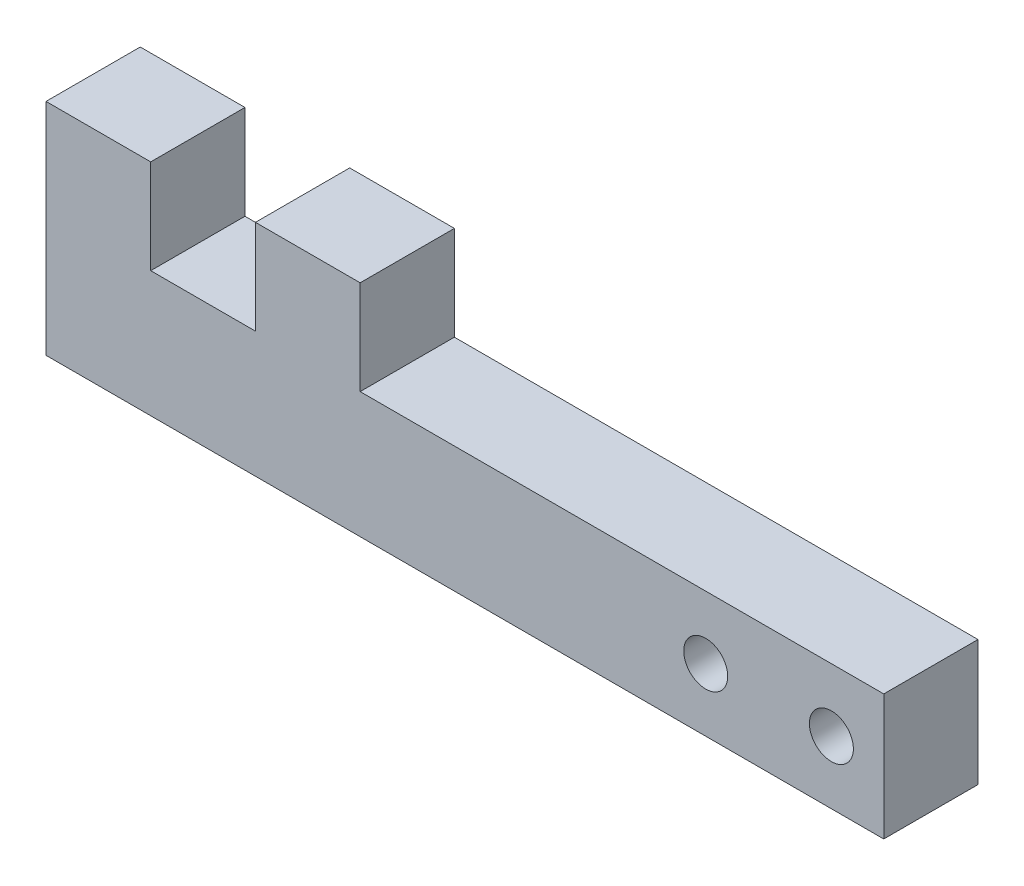
ISO-10303-21;
HEADER;
FILE_DESCRIPTION(('STEP AP214'),'2;1');
FILE_NAME('part.step','',(''),(''),'','','');
FILE_SCHEMA(('AUTOMOTIVE_DESIGN { 1 0 10303 214 1 1 1 1 }'));
ENDSEC;
DATA;
#1=APPLICATION_CONTEXT('core data for automotive mechanical design processes');
#2=APPLICATION_PROTOCOL_DEFINITION('international standard','automotive_design',2000,#1);
#3=PRODUCT_CONTEXT('',#1,'mechanical');
#4=PRODUCT('Part','Part','',(#3));
#5=PRODUCT_RELATED_PRODUCT_CATEGORY('part','',(#4));
#6=PRODUCT_DEFINITION_FORMATION('','',#4);
#7=PRODUCT_DEFINITION_CONTEXT('part definition',#1,'design');
#8=PRODUCT_DEFINITION('design','',#6,#7);
#9=PRODUCT_DEFINITION_SHAPE('','',#8);
#10=(LENGTH_UNIT() NAMED_UNIT(*) SI_UNIT(.MILLI.,.METRE.));
#11=(NAMED_UNIT(*) PLANE_ANGLE_UNIT() SI_UNIT($,.RADIAN.));
#12=(NAMED_UNIT(*) SI_UNIT($,.STERADIAN.) SOLID_ANGLE_UNIT());
#13=UNCERTAINTY_MEASURE_WITH_UNIT(LENGTH_MEASURE(1.E-05),#10,'distance_accuracy_value','');
#14=(GEOMETRIC_REPRESENTATION_CONTEXT(3) GLOBAL_UNCERTAINTY_ASSIGNED_CONTEXT((#13)) GLOBAL_UNIT_ASSIGNED_CONTEXT((#10,
#11,#12)) REPRESENTATION_CONTEXT('',''));
#15=CARTESIAN_POINT('',(0.,0.,0.));
#16=DIRECTION('',(0.,0.,1.));
#17=DIRECTION('',(1.,0.,0.));
#18=AXIS2_PLACEMENT_3D('',#15,#16,#17);
#19=CARTESIAN_POINT('',(0.,12.,9.));
#20=DIRECTION('',(0.,-1.,0.));
#21=DIRECTION('',(1.,0.,0.));
#22=AXIS2_PLACEMENT_3D('',#19,#20,#21);
#23=PLANE('',#22);
#24=DIRECTION('',(-1.,0.,0.));
#25=VECTOR('',#24,1.);
#26=CARTESIAN_POINT('',(0.,12.,9.));
#27=LINE('',#26,#25);
#28=CARTESIAN_POINT('',(20.,12.,9.));
#29=VERTEX_POINT('',#28);
#30=CARTESIAN_POINT('',(10.,12.,9.));
#31=VERTEX_POINT('',#30);
#32=EDGE_CURVE('E48',#29,#31,#27,.T.);
#33=ORIENTED_EDGE('',*,*,#32,.F.);
#34=DIRECTION('',(0.,0.,1.));
#35=VECTOR('',#34,1.);
#36=CARTESIAN_POINT('',(20.,12.,0.));
#37=LINE('',#36,#35);
#38=CARTESIAN_POINT('',(20.,12.,0.));
#39=VERTEX_POINT('',#38);
#40=EDGE_CURVE('E125',#39,#29,#37,.T.);
#41=ORIENTED_EDGE('',*,*,#40,.F.);
#42=DIRECTION('',(-1.,0.,0.));
#43=VECTOR('',#42,1.);
#44=CARTESIAN_POINT('',(0.,12.,0.));
#45=LINE('',#44,#43);
#46=CARTESIAN_POINT('',(10.,12.,0.));
#47=VERTEX_POINT('',#46);
#48=EDGE_CURVE('E112',#39,#47,#45,.T.);
#49=ORIENTED_EDGE('',*,*,#48,.T.);
#50=DIRECTION('',(0.,0.,1.));
#51=VECTOR('',#50,1.);
#52=CARTESIAN_POINT('',(10.,12.,0.));
#53=LINE('',#52,#51);
#54=EDGE_CURVE('E161',#47,#31,#53,.T.);
#55=ORIENTED_EDGE('',*,*,#54,.T.);
#56=EDGE_LOOP('',(#33,#41,#49,#55));
#57=FACE_BOUND('',#56,.T.);
#58=ADVANCED_FACE('F33',(#57),#23,.F.);
#59=CARTESIAN_POINT('',(0.,0.,9.));
#60=DIRECTION('',(1.,0.,0.));
#61=DIRECTION('',(0.,0.,-1.));
#62=AXIS2_PLACEMENT_3D('',#59,#60,#61);
#63=PLANE('',#62);
#64=DIRECTION('',(0.,-1.,0.));
#65=VECTOR('',#64,1.);
#66=CARTESIAN_POINT('',(0.,0.,0.));
#67=LINE('',#66,#65);
#68=CARTESIAN_POINT('',(0.,21.,0.));
#69=VERTEX_POINT('',#68);
#70=CARTESIAN_POINT('',(0.,0.,0.));
#71=VERTEX_POINT('',#70);
#72=EDGE_CURVE('E169',#69,#71,#67,.T.);
#73=ORIENTED_EDGE('',*,*,#72,.T.);
#74=DIRECTION('',(0.,0.,-1.));
#75=VECTOR('',#74,1.);
#76=CARTESIAN_POINT('',(0.,0.,9.));
#77=LINE('',#76,#75);
#78=CARTESIAN_POINT('',(0.,0.,9.));
#79=VERTEX_POINT('',#78);
#80=EDGE_CURVE('E11',#79,#71,#77,.T.);
#81=ORIENTED_EDGE('',*,*,#80,.F.);
#82=DIRECTION('',(0.,-1.,0.));
#83=VECTOR('',#82,1.);
#84=CARTESIAN_POINT('',(0.,0.,9.));
#85=LINE('',#84,#83);
#86=CARTESIAN_POINT('',(0.,21.,9.));
#87=VERTEX_POINT('',#86);
#88=EDGE_CURVE('E173',#87,#79,#85,.T.);
#89=ORIENTED_EDGE('',*,*,#88,.F.);
#90=DIRECTION('',(0.,0.,1.));
#91=VECTOR('',#90,1.);
#92=CARTESIAN_POINT('',(0.,21.,0.));
#93=LINE('',#92,#91);
#94=EDGE_CURVE('E166',#69,#87,#93,.T.);
#95=ORIENTED_EDGE('',*,*,#94,.F.);
#96=EDGE_LOOP('',(#73,#81,#89,#95));
#97=FACE_BOUND('',#96,.T.);
#98=ADVANCED_FACE('F35',(#97),#63,.F.);
#99=CARTESIAN_POINT('',(0.,0.,9.));
#100=DIRECTION('',(0.,1.,0.));
#101=DIRECTION('',(-1.,0.,0.));
#102=AXIS2_PLACEMENT_3D('',#99,#100,#101);
#103=PLANE('',#102);
#104=DIRECTION('',(1.,0.,0.));
#105=VECTOR('',#104,1.);
#106=CARTESIAN_POINT('',(0.,0.,0.));
#107=LINE('',#106,#105);
#108=CARTESIAN_POINT('',(80.,0.,0.));
#109=VERTEX_POINT('',#108);
#110=EDGE_CURVE('E185',#71,#109,#107,.T.);
#111=ORIENTED_EDGE('',*,*,#110,.T.);
#112=DIRECTION('',(0.,0.,-1.));
#113=VECTOR('',#112,1.);
#114=CARTESIAN_POINT('',(80.,0.,9.));
#115=LINE('',#114,#113);
#116=CARTESIAN_POINT('',(80.,0.,9.));
#117=VERTEX_POINT('',#116);
#118=EDGE_CURVE('E41',#117,#109,#115,.T.);
#119=ORIENTED_EDGE('',*,*,#118,.F.);
#120=DIRECTION('',(1.,0.,0.));
#121=VECTOR('',#120,1.);
#122=CARTESIAN_POINT('',(0.,0.,9.));
#123=LINE('',#122,#121);
#124=EDGE_CURVE('E176',#79,#117,#123,.T.);
#125=ORIENTED_EDGE('',*,*,#124,.F.);
#126=ORIENTED_EDGE('',*,*,#80,.T.);
#127=EDGE_LOOP('',(#111,#119,#125,#126));
#128=FACE_BOUND('',#127,.T.);
#129=ADVANCED_FACE('F217',(#128),#103,.F.);
#130=CARTESIAN_POINT('',(80.,0.,9.));
#131=DIRECTION('',(-1.,0.,0.));
#132=DIRECTION('',(0.,0.,1.));
#133=AXIS2_PLACEMENT_3D('',#130,#131,#132);
#134=PLANE('',#133);
#135=DIRECTION('',(0.,1.,0.));
#136=VECTOR('',#135,1.);
#137=CARTESIAN_POINT('',(80.,0.,0.));
#138=LINE('',#137,#136);
#139=CARTESIAN_POINT('',(80.,12.,0.));
#140=VERTEX_POINT('',#139);
#141=EDGE_CURVE('E123',#109,#140,#138,.T.);
#142=ORIENTED_EDGE('',*,*,#141,.T.);
#143=DIRECTION('',(0.,0.,-1.));
#144=VECTOR('',#143,1.);
#145=CARTESIAN_POINT('',(80.,12.,9.));
#146=LINE('',#145,#144);
#147=CARTESIAN_POINT('',(80.,12.,9.));
#148=VERTEX_POINT('',#147);
#149=EDGE_CURVE('E182',#148,#140,#146,.T.);
#150=ORIENTED_EDGE('',*,*,#149,.F.);
#151=DIRECTION('',(0.,1.,0.));
#152=VECTOR('',#151,1.);
#153=CARTESIAN_POINT('',(80.,0.,9.));
#154=LINE('',#153,#152);
#155=EDGE_CURVE('E178',#117,#148,#154,.T.);
#156=ORIENTED_EDGE('',*,*,#155,.F.);
#157=ORIENTED_EDGE('',*,*,#118,.T.);
#158=EDGE_LOOP('',(#142,#150,#156,#157));
#159=FACE_BOUND('',#158,.T.);
#160=ADVANCED_FACE('F194',(#159),#134,.F.);
#161=CARTESIAN_POINT('',(30.,12.,0.));
#162=VERTEX_POINT('',#161);
#163=EDGE_CURVE('E122',#140,#162,#45,.T.);
#164=ORIENTED_EDGE('',*,*,#163,.T.);
#165=DIRECTION('',(0.,0.,1.));
#166=VECTOR('',#165,1.);
#167=CARTESIAN_POINT('',(30.,12.,0.));
#168=LINE('',#167,#166);
#169=CARTESIAN_POINT('',(30.,12.,9.));
#170=VERTEX_POINT('',#169);
#171=EDGE_CURVE('E56',#162,#170,#168,.T.);
#172=ORIENTED_EDGE('',*,*,#171,.T.);
#173=EDGE_CURVE('E180',#148,#170,#27,.T.);
#174=ORIENTED_EDGE('',*,*,#173,.F.);
#175=ORIENTED_EDGE('',*,*,#149,.T.);
#176=EDGE_LOOP('',(#164,#172,#174,#175));
#177=FACE_BOUND('',#176,.T.);
#178=ADVANCED_FACE('F199',(#177),#23,.F.);
#179=CARTESIAN_POINT('',(0.,0.,9.));
#180=DIRECTION('',(0.,0.,-1.));
#181=DIRECTION('',(-1.,0.,0.));
#182=AXIS2_PLACEMENT_3D('',#179,#180,#181);
#183=PLANE('',#182);
#184=CARTESIAN_POINT('',(75.,6.00000000000001,9.));
#185=DIRECTION('',(0.,0.,1.));
#186=DIRECTION('',(1.,0.,0.));
#187=AXIS2_PLACEMENT_3D('',#184,#185,#186);
#188=CIRCLE('',#187,2.1);
#189=CARTESIAN_POINT('',(77.1,6.00000000000001,9.));
#190=VERTEX_POINT('',#189);
#191=EDGE_CURVE('E266',#190,#190,#188,.T.);
#192=ORIENTED_EDGE('',*,*,#191,.F.);
#193=EDGE_LOOP('',(#192));
#194=FACE_BOUND('',#193,.T.);
#195=CARTESIAN_POINT('',(63.,6.00000000000001,9.));
#196=DIRECTION('',(0.,0.,1.));
#197=DIRECTION('',(1.,0.,0.));
#198=AXIS2_PLACEMENT_3D('',#195,#196,#197);
#199=CIRCLE('',#198,2.1);
#200=CARTESIAN_POINT('',(65.1,6.00000000000001,9.));
#201=VERTEX_POINT('',#200);
#202=EDGE_CURVE('E142',#201,#201,#199,.T.);
#203=ORIENTED_EDGE('',*,*,#202,.F.);
#204=EDGE_LOOP('',(#203));
#205=FACE_BOUND('',#204,.T.);
#206=ORIENTED_EDGE('',*,*,#88,.T.);
#207=ORIENTED_EDGE('',*,*,#124,.T.);
#208=ORIENTED_EDGE('',*,*,#155,.T.);
#209=ORIENTED_EDGE('',*,*,#173,.T.);
#210=DIRECTION('',(0.,1.,0.));
#211=VECTOR('',#210,1.);
#212=CARTESIAN_POINT('',(30.,12.,9.));
#213=LINE('',#212,#211);
#214=CARTESIAN_POINT('',(30.,21.,9.));
#215=VERTEX_POINT('',#214);
#216=EDGE_CURVE('E139',#170,#215,#213,.T.);
#217=ORIENTED_EDGE('',*,*,#216,.T.);
#218=DIRECTION('',(-1.,0.,0.));
#219=VECTOR('',#218,1.);
#220=CARTESIAN_POINT('',(20.,21.,9.));
#221=LINE('',#220,#219);
#222=CARTESIAN_POINT('',(20.,21.,9.));
#223=VERTEX_POINT('',#222);
#224=EDGE_CURVE('E134',#215,#223,#221,.T.);
#225=ORIENTED_EDGE('',*,*,#224,.T.);
#226=DIRECTION('',(0.,-1.,0.));
#227=VECTOR('',#226,1.);
#228=CARTESIAN_POINT('',(20.,12.,9.));
#229=LINE('',#228,#227);
#230=EDGE_CURVE('E146',#223,#29,#229,.T.);
#231=ORIENTED_EDGE('',*,*,#230,.T.);
#232=ORIENTED_EDGE('',*,*,#32,.T.);
#233=DIRECTION('',(0.,1.,0.));
#234=VECTOR('',#233,1.);
#235=CARTESIAN_POINT('',(10.,12.,9.));
#236=LINE('',#235,#234);
#237=CARTESIAN_POINT('',(10.,21.,9.));
#238=VERTEX_POINT('',#237);
#239=EDGE_CURVE('E152',#31,#238,#236,.T.);
#240=ORIENTED_EDGE('',*,*,#239,.T.);
#241=DIRECTION('',(-1.,0.,0.));
#242=VECTOR('',#241,1.);
#243=CARTESIAN_POINT('',(0.,21.,9.));
#244=LINE('',#243,#242);
#245=EDGE_CURVE('E158',#238,#87,#244,.T.);
#246=ORIENTED_EDGE('',*,*,#245,.T.);
#247=EDGE_LOOP('',(#206,#207,#208,#209,#217,#225,#231,#232,#240,#246));
#248=FACE_BOUND('',#247,.T.);
#249=ADVANCED_FACE('F205',(#194,#205,#248),#183,.F.);
#250=CARTESIAN_POINT('',(0.,0.,0.));
#251=DIRECTION('',(0.,0.,-1.));
#252=DIRECTION('',(-1.,0.,0.));
#253=AXIS2_PLACEMENT_3D('',#250,#251,#252);
#254=PLANE('',#253);
#255=CARTESIAN_POINT('',(75.,6.00000000000001,0.));
#256=DIRECTION('',(0.,0.,1.));
#257=DIRECTION('',(1.,0.,0.));
#258=AXIS2_PLACEMENT_3D('',#255,#256,#257);
#259=CIRCLE('',#258,2.1);
#260=CARTESIAN_POINT('',(77.1,6.00000000000001,0.));
#261=VERTEX_POINT('',#260);
#262=EDGE_CURVE('E264',#261,#261,#259,.T.);
#263=ORIENTED_EDGE('',*,*,#262,.T.);
#264=EDGE_LOOP('',(#263));
#265=FACE_BOUND('',#264,.T.);
#266=CARTESIAN_POINT('',(63.,6.00000000000001,0.));
#267=DIRECTION('',(0.,0.,1.));
#268=DIRECTION('',(1.,0.,0.));
#269=AXIS2_PLACEMENT_3D('',#266,#267,#268);
#270=CIRCLE('',#269,2.1);
#271=CARTESIAN_POINT('',(65.1,6.00000000000001,0.));
#272=VERTEX_POINT('',#271);
#273=EDGE_CURVE('E148',#272,#272,#270,.T.);
#274=ORIENTED_EDGE('',*,*,#273,.T.);
#275=EDGE_LOOP('',(#274));
#276=FACE_BOUND('',#275,.T.);
#277=ORIENTED_EDGE('',*,*,#72,.F.);
#278=DIRECTION('',(-1.,0.,0.));
#279=VECTOR('',#278,1.);
#280=CARTESIAN_POINT('',(0.,21.,0.));
#281=LINE('',#280,#279);
#282=CARTESIAN_POINT('',(10.,21.,0.));
#283=VERTEX_POINT('',#282);
#284=EDGE_CURVE('E157',#283,#69,#281,.T.);
#285=ORIENTED_EDGE('',*,*,#284,.F.);
#286=DIRECTION('',(0.,1.,0.));
#287=VECTOR('',#286,1.);
#288=CARTESIAN_POINT('',(10.,12.,0.));
#289=LINE('',#288,#287);
#290=EDGE_CURVE('E120',#47,#283,#289,.T.);
#291=ORIENTED_EDGE('',*,*,#290,.F.);
#292=ORIENTED_EDGE('',*,*,#48,.F.);
#293=DIRECTION('',(0.,-1.,0.));
#294=VECTOR('',#293,1.);
#295=CARTESIAN_POINT('',(20.,12.,0.));
#296=LINE('',#295,#294);
#297=CARTESIAN_POINT('',(20.,21.,0.));
#298=VERTEX_POINT('',#297);
#299=EDGE_CURVE('E116',#298,#39,#296,.T.);
#300=ORIENTED_EDGE('',*,*,#299,.F.);
#301=DIRECTION('',(-1.,0.,0.));
#302=VECTOR('',#301,1.);
#303=CARTESIAN_POINT('',(20.,21.,0.));
#304=LINE('',#303,#302);
#305=CARTESIAN_POINT('',(30.,21.,0.));
#306=VERTEX_POINT('',#305);
#307=EDGE_CURVE('E129',#306,#298,#304,.T.);
#308=ORIENTED_EDGE('',*,*,#307,.F.);
#309=DIRECTION('',(0.,1.,0.));
#310=VECTOR('',#309,1.);
#311=CARTESIAN_POINT('',(30.,12.,0.));
#312=LINE('',#311,#310);
#313=EDGE_CURVE('E133',#162,#306,#312,.T.);
#314=ORIENTED_EDGE('',*,*,#313,.F.);
#315=ORIENTED_EDGE('',*,*,#163,.F.);
#316=ORIENTED_EDGE('',*,*,#141,.F.);
#317=ORIENTED_EDGE('',*,*,#110,.F.);
#318=EDGE_LOOP('',(#277,#285,#291,#292,#300,#308,#314,#315,#316,#317));
#319=FACE_BOUND('',#318,.T.);
#320=ADVANCED_FACE('F113',(#265,#276,#319),#254,.T.);
#321=CARTESIAN_POINT('',(0.,21.,0.));
#322=DIRECTION('',(0.,1.,0.));
#323=DIRECTION('',(0.,0.,1.));
#324=AXIS2_PLACEMENT_3D('',#321,#322,#323);
#325=PLANE('',#324);
#326=ORIENTED_EDGE('',*,*,#245,.F.);
#327=DIRECTION('',(0.,0.,1.));
#328=VECTOR('',#327,1.);
#329=CARTESIAN_POINT('',(10.,21.,0.));
#330=LINE('',#329,#328);
#331=EDGE_CURVE('E170',#283,#238,#330,.T.);
#332=ORIENTED_EDGE('',*,*,#331,.F.);
#333=ORIENTED_EDGE('',*,*,#284,.T.);
#334=ORIENTED_EDGE('',*,*,#94,.T.);
#335=EDGE_LOOP('',(#326,#332,#333,#334));
#336=FACE_BOUND('',#335,.T.);
#337=ADVANCED_FACE('F213',(#336),#325,.T.);
#338=CARTESIAN_POINT('',(10.,12.,0.));
#339=DIRECTION('',(1.,0.,0.));
#340=DIRECTION('',(0.,0.,-1.));
#341=AXIS2_PLACEMENT_3D('',#338,#339,#340);
#342=PLANE('',#341);
#343=ORIENTED_EDGE('',*,*,#239,.F.);
#344=ORIENTED_EDGE('',*,*,#54,.F.);
#345=ORIENTED_EDGE('',*,*,#290,.T.);
#346=ORIENTED_EDGE('',*,*,#331,.T.);
#347=EDGE_LOOP('',(#343,#344,#345,#346));
#348=FACE_BOUND('',#347,.T.);
#349=ADVANCED_FACE('F211',(#348),#342,.T.);
#350=CARTESIAN_POINT('',(20.,12.,0.));
#351=DIRECTION('',(-1.,0.,0.));
#352=DIRECTION('',(0.,-1.,0.));
#353=AXIS2_PLACEMENT_3D('',#350,#351,#352);
#354=PLANE('',#353);
#355=ORIENTED_EDGE('',*,*,#230,.F.);
#356=DIRECTION('',(0.,0.,1.));
#357=VECTOR('',#356,1.);
#358=CARTESIAN_POINT('',(20.,21.,0.));
#359=LINE('',#358,#357);
#360=EDGE_CURVE('E132',#298,#223,#359,.T.);
#361=ORIENTED_EDGE('',*,*,#360,.F.);
#362=ORIENTED_EDGE('',*,*,#299,.T.);
#363=ORIENTED_EDGE('',*,*,#40,.T.);
#364=EDGE_LOOP('',(#355,#361,#362,#363));
#365=FACE_BOUND('',#364,.T.);
#366=ADVANCED_FACE('F131',(#365),#354,.T.);
#367=CARTESIAN_POINT('',(20.,21.,0.));
#368=DIRECTION('',(0.,1.,0.));
#369=DIRECTION('',(0.,0.,1.));
#370=AXIS2_PLACEMENT_3D('',#367,#368,#369);
#371=PLANE('',#370);
#372=ORIENTED_EDGE('',*,*,#224,.F.);
#373=DIRECTION('',(0.,0.,1.));
#374=VECTOR('',#373,1.);
#375=CARTESIAN_POINT('',(30.,21.,0.));
#376=LINE('',#375,#374);
#377=EDGE_CURVE('E153',#306,#215,#376,.T.);
#378=ORIENTED_EDGE('',*,*,#377,.F.);
#379=ORIENTED_EDGE('',*,*,#307,.T.);
#380=ORIENTED_EDGE('',*,*,#360,.T.);
#381=EDGE_LOOP('',(#372,#378,#379,#380));
#382=FACE_BOUND('',#381,.T.);
#383=ADVANCED_FACE('F207',(#382),#371,.T.);
#384=CARTESIAN_POINT('',(30.,12.,0.));
#385=DIRECTION('',(1.,0.,0.));
#386=DIRECTION('',(0.,0.,-1.));
#387=AXIS2_PLACEMENT_3D('',#384,#385,#386);
#388=PLANE('',#387);
#389=ORIENTED_EDGE('',*,*,#216,.F.);
#390=ORIENTED_EDGE('',*,*,#171,.F.);
#391=ORIENTED_EDGE('',*,*,#313,.T.);
#392=ORIENTED_EDGE('',*,*,#377,.T.);
#393=EDGE_LOOP('',(#389,#390,#391,#392));
#394=FACE_BOUND('',#393,.T.);
#395=ADVANCED_FACE('F202',(#394),#388,.T.);
#396=CARTESIAN_POINT('',(63.,6.00000000000001,0.));
#397=DIRECTION('',(0.,0.,1.));
#398=DIRECTION('',(1.,0.,0.));
#399=AXIS2_PLACEMENT_3D('',#396,#397,#398);
#400=CYLINDRICAL_SURFACE('',#399,2.1);
#401=ORIENTED_EDGE('',*,*,#273,.F.);
#402=EDGE_LOOP('',(#401));
#403=FACE_BOUND('',#402,.T.);
#404=ORIENTED_EDGE('',*,*,#202,.T.);
#405=EDGE_LOOP('',(#404));
#406=FACE_BOUND('',#405,.T.);
#407=ADVANCED_FACE('F250',(#403,#406),#400,.F.);
#408=CARTESIAN_POINT('',(75.,6.00000000000001,0.));
#409=DIRECTION('',(0.,0.,1.));
#410=DIRECTION('',(1.,0.,0.));
#411=AXIS2_PLACEMENT_3D('',#408,#409,#410);
#412=CYLINDRICAL_SURFACE('',#411,2.1);
#413=ORIENTED_EDGE('',*,*,#262,.F.);
#414=EDGE_LOOP('',(#413));
#415=FACE_BOUND('',#414,.T.);
#416=ORIENTED_EDGE('',*,*,#191,.T.);
#417=EDGE_LOOP('',(#416));
#418=FACE_BOUND('',#417,.T.);
#419=ADVANCED_FACE('F255',(#415,#418),#412,.F.);
#420=CLOSED_SHELL('',(#58,#98,#129,#160,#178,#249,#320,#337,#349,#366,#383,#395,#407,#419));
#421=MANIFOLD_SOLID_BREP('B2',#420);
#422=ADVANCED_BREP_SHAPE_REPRESENTATION('',(#18,#421),#14);
#423=SHAPE_DEFINITION_REPRESENTATION(#9,#422);
ENDSEC;
END-ISO-10303-21;
